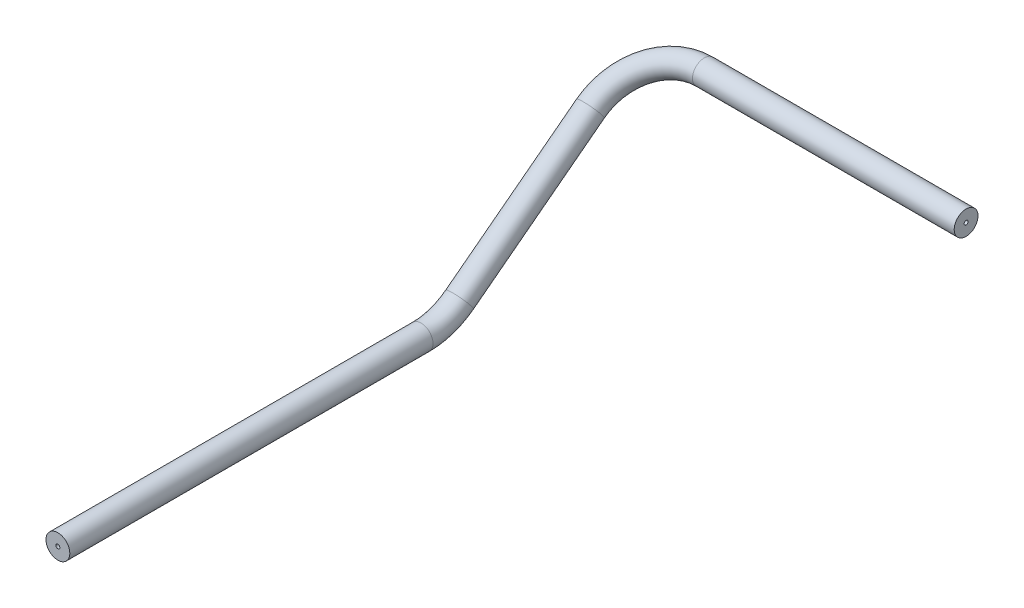
ISO-10303-21;
HEADER;
FILE_DESCRIPTION(('STEP AP214'),'2;1');
FILE_NAME('part.step','',(''),(''),'','','');
FILE_SCHEMA(('AUTOMOTIVE_DESIGN { 1 0 10303 214 1 1 1 1 }'));
ENDSEC;
DATA;
#1=APPLICATION_CONTEXT('core data for automotive mechanical design processes');
#2=APPLICATION_PROTOCOL_DEFINITION('international standard','automotive_design',2000,#1);
#3=PRODUCT_CONTEXT('',#1,'mechanical');
#4=PRODUCT('Part','Part','',(#3));
#5=PRODUCT_RELATED_PRODUCT_CATEGORY('part','',(#4));
#6=PRODUCT_DEFINITION_FORMATION('','',#4);
#7=PRODUCT_DEFINITION_CONTEXT('part definition',#1,'design');
#8=PRODUCT_DEFINITION('design','',#6,#7);
#9=PRODUCT_DEFINITION_SHAPE('','',#8);
#10=(LENGTH_UNIT() NAMED_UNIT(*) SI_UNIT(.MILLI.,.METRE.));
#11=(NAMED_UNIT(*) PLANE_ANGLE_UNIT() SI_UNIT($,.RADIAN.));
#12=(NAMED_UNIT(*) SI_UNIT($,.STERADIAN.) SOLID_ANGLE_UNIT());
#13=UNCERTAINTY_MEASURE_WITH_UNIT(LENGTH_MEASURE(1.E-05),#10,'distance_accuracy_value','');
#14=(GEOMETRIC_REPRESENTATION_CONTEXT(3) GLOBAL_UNCERTAINTY_ASSIGNED_CONTEXT((#13)) GLOBAL_UNIT_ASSIGNED_CONTEXT((#10,
#11,#12)) REPRESENTATION_CONTEXT('',''));
#15=CARTESIAN_POINT('',(0.,0.,0.));
#16=DIRECTION('',(0.,0.,1.));
#17=DIRECTION('',(1.,0.,0.));
#18=AXIS2_PLACEMENT_3D('',#15,#16,#17);
#19=CARTESIAN_POINT('',(82.,0.,0.));
#20=DIRECTION('',(-1.,0.,0.));
#21=DIRECTION('',(0.,0.,1.));
#22=AXIS2_PLACEMENT_3D('',#19,#20,#21);
#23=CYLINDRICAL_SURFACE('',#22,3.);
#24=CARTESIAN_POINT('',(16.,0.,0.));
#25=DIRECTION('',(1.,0.,0.));
#26=DIRECTION('',(0.,0.,-1.));
#27=AXIS2_PLACEMENT_3D('',#24,#25,#26);
#28=CIRCLE('',#27,3.);
#29=CARTESIAN_POINT('',(16.,1.82128832393702,-2.38388524075527));
#30=VERTEX_POINT('',#29);
#31=EDGE_CURVE('E61',#30,#30,#28,.T.);
#32=ORIENTED_EDGE('',*,*,#31,.T.);
#33=EDGE_LOOP('',(#32));
#34=FACE_BOUND('',#33,.T.);
#35=CARTESIAN_POINT('',(82.,0.,0.));
#36=DIRECTION('',(1.,0.,0.));
#37=DIRECTION('',(0.,0.,-1.));
#38=AXIS2_PLACEMENT_3D('',#35,#36,#37);
#39=CIRCLE('',#38,3.);
#40=CARTESIAN_POINT('',(82.,0.,-3.));
#41=VERTEX_POINT('',#40);
#42=EDGE_CURVE('E58',#41,#41,#39,.T.);
#43=ORIENTED_EDGE('',*,*,#42,.F.);
#44=EDGE_LOOP('',(#43));
#45=FACE_BOUND('',#44,.T.);
#46=ADVANCED_FACE('F37',(#34,#45),#23,.T.);
#47=CARTESIAN_POINT('',(16.,-9.71353772766406,12.7140546173613));
#48=DIRECTION('',(0.,0.794628413585083,0.607096107979004));
#49=DIRECTION('',(0.,-0.607096107979004,0.794628413585083));
#50=AXIS2_PLACEMENT_3D('',#47,#48,#49);
#51=TOROIDAL_SURFACE('',#50,16.,3.);
#52=CARTESIAN_POINT('',(0.,-9.71353772766406,12.7140546173613));
#53=DIRECTION('',(0.,0.607096107979004,-0.794628413585083));
#54=DIRECTION('',(-0.794628413585083,-0.482415817177034,-0.368565684323254));
#55=AXIS2_PLACEMENT_3D('',#52,#53,#54);
#56=CIRCLE('',#55,3.);
#57=CARTESIAN_POINT('',(-3.00000000000002,-9.71353772766405,12.7140546173613));
#58=VERTEX_POINT('',#57);
#59=EDGE_CURVE('E64',#58,#58,#56,.T.);
#60=CARTESIAN_POINT('',(16.,-9.71353772766406,12.7140546173613));
#61=DIRECTION('',(0.,0.794628413585083,0.607096107979004));
#62=DIRECTION('',(0.,-0.607096107979004,0.794628413585083));
#63=AXIS2_PLACEMENT_3D('',#60,#61,#62);
#64=CIRCLE('',#63,19.);
#65=EDGE_CURVE('',#30,#58,#64,.T.);
#66=ORIENTED_EDGE('',*,*,#31,.F.);
#67=ORIENTED_EDGE('',*,*,#59,.T.);
#68=ORIENTED_EDGE('',*,*,#65,.T.);
#69=ORIENTED_EDGE('',*,*,#65,.F.);
#70=EDGE_LOOP('',(#66,#68,#67,#69));
#71=FACE_BOUND('',#70,.T.);
#72=ADVANCED_FACE('F106',(#71),#51,.T.);
#73=CARTESIAN_POINT('',(0.,-9.71353772766406,12.7140546173613));
#74=DIRECTION('',(0.,-0.607096107979004,0.794628413585083));
#75=DIRECTION('',(0.,-0.794628413585083,-0.607096107979004));
#76=AXIS2_PLACEMENT_3D('',#73,#74,#75);
#77=CYLINDRICAL_SURFACE('',#76,3.);
#78=CARTESIAN_POINT('',(0.,-34.9140546173613,45.699024368274));
#79=DIRECTION('',(0.,0.607096107979004,-0.794628413585083));
#80=DIRECTION('',(-0.794628413585083,-0.482415817177034,-0.368565684323254));
#81=AXIS2_PLACEMENT_3D('',#78,#79,#80);
#82=CIRCLE('',#81,3.);
#83=CARTESIAN_POINT('',(0.,-37.2979398581166,43.877736044337));
#84=VERTEX_POINT('',#83);
#85=EDGE_CURVE('E66',#84,#84,#82,.T.);
#86=ORIENTED_EDGE('',*,*,#85,.T.);
#87=EDGE_LOOP('',(#86));
#88=FACE_BOUND('',#87,.T.);
#89=ORIENTED_EDGE('',*,*,#59,.F.);
#90=EDGE_LOOP('',(#89));
#91=FACE_BOUND('',#90,.T.);
#92=ADVANCED_FACE('F86',(#88,#91),#77,.T.);
#93=CARTESIAN_POINT('',(0.,-22.2,55.4125620959381));
#94=DIRECTION('',(-1.,0.,0.));
#95=DIRECTION('',(0.,0.,1.));
#96=AXIS2_PLACEMENT_3D('',#93,#94,#95);
#97=TOROIDAL_SURFACE('',#96,16.,3.);
#98=CARTESIAN_POINT('',(0.,-38.2,55.412562095938));
#99=DIRECTION('',(0.,0.,-1.));
#100=DIRECTION('',(-0.794628413585083,-0.607096107979004,0.));
#101=AXIS2_PLACEMENT_3D('',#98,#99,#100);
#102=CIRCLE('',#101,3.);
#103=CARTESIAN_POINT('',(0.,-41.2,55.412562095938));
#104=VERTEX_POINT('',#103);
#105=EDGE_CURVE('E41',#104,#104,#102,.T.);
#106=CARTESIAN_POINT('',(0.,-22.2,55.4125620959381));
#107=DIRECTION('',(-1.,0.,0.));
#108=DIRECTION('',(0.,0.,1.));
#109=AXIS2_PLACEMENT_3D('',#106,#107,#108);
#110=CIRCLE('',#109,19.);
#111=EDGE_CURVE('',#84,#104,#110,.T.);
#112=ORIENTED_EDGE('',*,*,#85,.F.);
#113=ORIENTED_EDGE('',*,*,#105,.T.);
#114=ORIENTED_EDGE('',*,*,#111,.T.);
#115=ORIENTED_EDGE('',*,*,#111,.F.);
#116=EDGE_LOOP('',(#112,#114,#113,#115));
#117=FACE_BOUND('',#116,.T.);
#118=ADVANCED_FACE('F73',(#117),#97,.T.);
#119=CARTESIAN_POINT('',(0.,-38.2,55.412562095938));
#120=DIRECTION('',(0.,0.,1.));
#121=DIRECTION('',(0.,-1.,0.));
#122=AXIS2_PLACEMENT_3D('',#119,#120,#121);
#123=CYLINDRICAL_SURFACE('',#122,3.);
#124=CARTESIAN_POINT('',(0.,-38.2,147.));
#125=DIRECTION('',(0.,0.,-1.));
#126=DIRECTION('',(-0.794628413585083,-0.607096107979004,0.));
#127=AXIS2_PLACEMENT_3D('',#124,#125,#126);
#128=CIRCLE('',#127,3.);
#129=CARTESIAN_POINT('',(-2.38388524075525,-40.021288323937,147.));
#130=VERTEX_POINT('',#129);
#131=EDGE_CURVE('E54',#130,#130,#128,.T.);
#132=ORIENTED_EDGE('',*,*,#131,.T.);
#133=EDGE_LOOP('',(#132));
#134=FACE_BOUND('',#133,.T.);
#135=ORIENTED_EDGE('',*,*,#105,.F.);
#136=EDGE_LOOP('',(#135));
#137=FACE_BOUND('',#136,.T.);
#138=ADVANCED_FACE('F39',(#134,#137),#123,.T.);
#139=CARTESIAN_POINT('',(82.,0.,0.));
#140=DIRECTION('',(1.,0.,0.));
#141=DIRECTION('',(0.,0.,-1.));
#142=AXIS2_PLACEMENT_3D('',#139,#140,#141);
#143=PLANE('',#142);
#144=CARTESIAN_POINT('',(82.,0.,0.));
#145=DIRECTION('',(1.,0.,0.));
#146=DIRECTION('',(0.,0.,-1.));
#147=AXIS2_PLACEMENT_3D('',#144,#145,#146);
#148=CIRCLE('',#147,0.5);
#149=CARTESIAN_POINT('',(82.,0.,-0.5));
#150=VERTEX_POINT('',#149);
#151=EDGE_CURVE('E57',#150,#150,#148,.F.);
#152=ORIENTED_EDGE('',*,*,#151,.T.);
#153=EDGE_LOOP('',(#152));
#154=FACE_BOUND('',#153,.T.);
#155=ORIENTED_EDGE('',*,*,#42,.T.);
#156=EDGE_LOOP('',(#155));
#157=FACE_BOUND('',#156,.T.);
#158=ADVANCED_FACE('F77',(#154,#157),#143,.T.);
#159=CARTESIAN_POINT('',(0.,-38.2,147.));
#160=DIRECTION('',(0.,0.,-1.));
#161=DIRECTION('',(-0.794628413585083,-0.607096107979004,0.));
#162=AXIS2_PLACEMENT_3D('',#159,#160,#161);
#163=PLANE('',#162);
#164=CARTESIAN_POINT('',(0.,-38.2,147.));
#165=DIRECTION('',(0.,0.,-1.));
#166=DIRECTION('',(-0.794628413585083,-0.607096107979004,0.));
#167=AXIS2_PLACEMENT_3D('',#164,#165,#166);
#168=CIRCLE('',#167,0.5);
#169=CARTESIAN_POINT('',(-0.397314206792542,-38.5035480539895,147.));
#170=VERTEX_POINT('',#169);
#171=EDGE_CURVE('E10',#170,#170,#168,.F.);
#172=ORIENTED_EDGE('',*,*,#171,.F.);
#173=EDGE_LOOP('',(#172));
#174=FACE_BOUND('',#173,.T.);
#175=ORIENTED_EDGE('',*,*,#131,.F.);
#176=EDGE_LOOP('',(#175));
#177=FACE_BOUND('',#176,.T.);
#178=ADVANCED_FACE('F83',(#174,#177),#163,.F.);
#179=CARTESIAN_POINT('',(82.,0.,0.));
#180=DIRECTION('',(-1.,0.,0.));
#181=DIRECTION('',(0.,0.,1.));
#182=AXIS2_PLACEMENT_3D('',#179,#180,#181);
#183=CYLINDRICAL_SURFACE('',#182,0.5);
#184=CARTESIAN_POINT('',(16.,0.,0.));
#185=DIRECTION('',(1.,0.,0.));
#186=DIRECTION('',(0.,0.,-1.));
#187=AXIS2_PLACEMENT_3D('',#184,#185,#186);
#188=CIRCLE('',#187,0.5);
#189=CARTESIAN_POINT('',(16.,0.303548053989515,-0.39731420679256));
#190=VERTEX_POINT('',#189);
#191=EDGE_CURVE('E191',#190,#190,#188,.F.);
#192=ORIENTED_EDGE('',*,*,#191,.T.);
#193=EDGE_LOOP('',(#192));
#194=FACE_BOUND('',#193,.T.);
#195=ORIENTED_EDGE('',*,*,#151,.F.);
#196=EDGE_LOOP('',(#195));
#197=FACE_BOUND('',#196,.T.);
#198=ADVANCED_FACE('F101',(#194,#197),#183,.F.);
#199=CARTESIAN_POINT('',(16.,-9.71353772766406,12.7140546173613));
#200=DIRECTION('',(0.,0.794628413585083,0.607096107979004));
#201=DIRECTION('',(0.,-0.607096107979004,0.794628413585083));
#202=AXIS2_PLACEMENT_3D('',#199,#200,#201);
#203=TOROIDAL_SURFACE('',#202,16.,0.5);
#204=CARTESIAN_POINT('',(0.,-9.71353772766406,12.7140546173613));
#205=DIRECTION('',(0.,0.607096107979004,-0.794628413585083));
#206=DIRECTION('',(-0.794628413585083,-0.482415817177034,-0.368565684323254));
#207=AXIS2_PLACEMENT_3D('',#204,#205,#206);
#208=CIRCLE('',#207,0.5);
#209=CARTESIAN_POINT('',(-0.500000000000018,-9.71353772766406,12.7140546173613));
#210=VERTEX_POINT('',#209);
#211=EDGE_CURVE('E190',#210,#210,#208,.F.);
#212=CARTESIAN_POINT('',(16.,-9.71353772766406,12.7140546173613));
#213=DIRECTION('',(0.,0.794628413585083,0.607096107979004));
#214=DIRECTION('',(0.,-0.607096107979004,0.794628413585083));
#215=AXIS2_PLACEMENT_3D('',#212,#213,#214);
#216=CIRCLE('',#215,16.5);
#217=EDGE_CURVE('',#190,#210,#216,.T.);
#218=ORIENTED_EDGE('',*,*,#191,.F.);
#219=ORIENTED_EDGE('',*,*,#211,.T.);
#220=ORIENTED_EDGE('',*,*,#217,.T.);
#221=ORIENTED_EDGE('',*,*,#217,.F.);
#222=EDGE_LOOP('',(#218,#220,#219,#221));
#223=FACE_BOUND('',#222,.T.);
#224=ADVANCED_FACE('F154',(#223),#203,.F.);
#225=CARTESIAN_POINT('',(0.,-9.71353772766406,12.7140546173613));
#226=DIRECTION('',(0.,-0.607096107979004,0.794628413585083));
#227=DIRECTION('',(0.,-0.794628413585083,-0.607096107979004));
#228=AXIS2_PLACEMENT_3D('',#225,#226,#227);
#229=CYLINDRICAL_SURFACE('',#228,0.5);
#230=CARTESIAN_POINT('',(0.,-34.9140546173613,45.699024368274));
#231=DIRECTION('',(0.,0.607096107979004,-0.794628413585083));
#232=DIRECTION('',(-0.794628413585083,-0.482415817177034,-0.368565684323254));
#233=AXIS2_PLACEMENT_3D('',#230,#231,#232);
#234=CIRCLE('',#233,0.5);
#235=CARTESIAN_POINT('',(0.,-35.3113688241539,45.3954763142845));
#236=VERTEX_POINT('',#235);
#237=EDGE_CURVE('E50',#236,#236,#234,.F.);
#238=ORIENTED_EDGE('',*,*,#237,.T.);
#239=EDGE_LOOP('',(#238));
#240=FACE_BOUND('',#239,.T.);
#241=ORIENTED_EDGE('',*,*,#211,.F.);
#242=EDGE_LOOP('',(#241));
#243=FACE_BOUND('',#242,.T.);
#244=ADVANCED_FACE('F94',(#240,#243),#229,.F.);
#245=CARTESIAN_POINT('',(0.,-22.2,55.4125620959381));
#246=DIRECTION('',(-1.,0.,0.));
#247=DIRECTION('',(0.,0.,1.));
#248=AXIS2_PLACEMENT_3D('',#245,#246,#247);
#249=TOROIDAL_SURFACE('',#248,16.,0.5);
#250=CARTESIAN_POINT('',(0.,-38.2,55.412562095938));
#251=DIRECTION('',(0.,0.,-1.));
#252=DIRECTION('',(-0.794628413585083,-0.607096107979004,0.));
#253=AXIS2_PLACEMENT_3D('',#250,#251,#252);
#254=CIRCLE('',#253,0.5);
#255=CARTESIAN_POINT('',(0.,-38.7,55.412562095938));
#256=VERTEX_POINT('',#255);
#257=EDGE_CURVE('E45',#256,#256,#254,.F.);
#258=CARTESIAN_POINT('',(0.,-22.2,55.4125620959381));
#259=DIRECTION('',(-1.,0.,0.));
#260=DIRECTION('',(0.,0.,1.));
#261=AXIS2_PLACEMENT_3D('',#258,#259,#260);
#262=CIRCLE('',#261,16.5);
#263=EDGE_CURVE('',#236,#256,#262,.T.);
#264=ORIENTED_EDGE('',*,*,#237,.F.);
#265=ORIENTED_EDGE('',*,*,#257,.T.);
#266=ORIENTED_EDGE('',*,*,#263,.T.);
#267=ORIENTED_EDGE('',*,*,#263,.F.);
#268=EDGE_LOOP('',(#264,#266,#265,#267));
#269=FACE_BOUND('',#268,.T.);
#270=ADVANCED_FACE('F89',(#269),#249,.F.);
#271=CARTESIAN_POINT('',(0.,-38.2,55.412562095938));
#272=DIRECTION('',(0.,0.,1.));
#273=DIRECTION('',(0.,-1.,0.));
#274=AXIS2_PLACEMENT_3D('',#271,#272,#273);
#275=CYLINDRICAL_SURFACE('',#274,0.5);
#276=ORIENTED_EDGE('',*,*,#171,.T.);
#277=EDGE_LOOP('',(#276));
#278=FACE_BOUND('',#277,.T.);
#279=ORIENTED_EDGE('',*,*,#257,.F.);
#280=EDGE_LOOP('',(#279));
#281=FACE_BOUND('',#280,.T.);
#282=ADVANCED_FACE('F87',(#278,#281),#275,.F.);
#283=CLOSED_SHELL('',(#46,#72,#92,#118,#138,#158,#178,#198,#224,#244,#270,#282));
#284=MANIFOLD_SOLID_BREP('B2',#283);
#285=ADVANCED_BREP_SHAPE_REPRESENTATION('',(#18,#284),#14);
#286=SHAPE_DEFINITION_REPRESENTATION(#9,#285);
ENDSEC;
END-ISO-10303-21;
